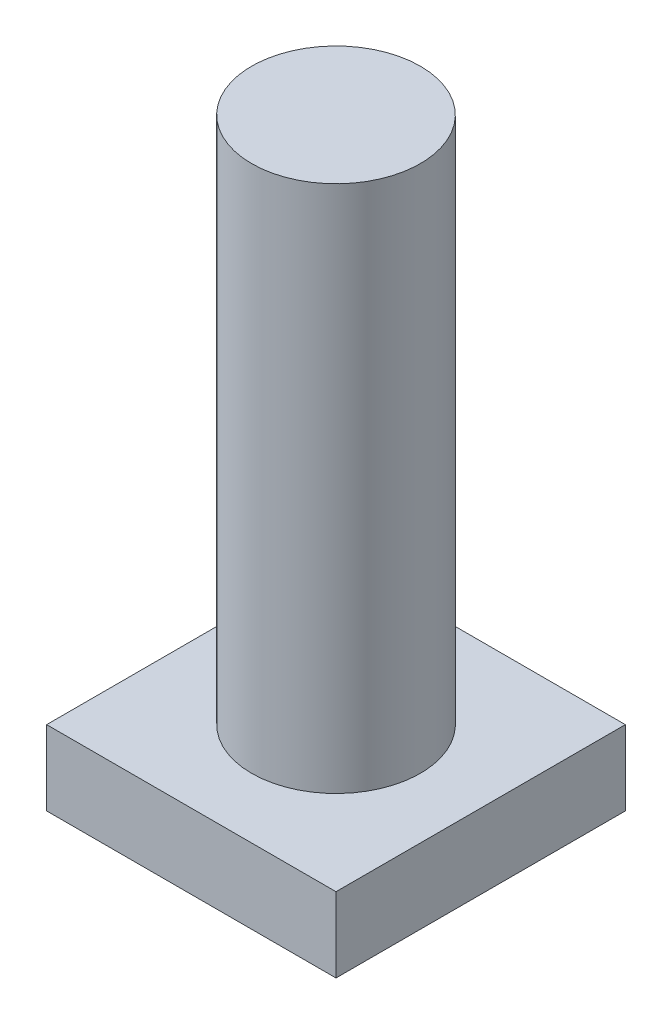
ISO-10303-21;
HEADER;
FILE_DESCRIPTION(('STEP AP214'),'2;1');
FILE_NAME('part.step','',(''),(''),'','','');
FILE_SCHEMA(('AUTOMOTIVE_DESIGN { 1 0 10303 214 1 1 1 1 }'));
ENDSEC;
DATA;
#1=APPLICATION_CONTEXT('core data for automotive mechanical design processes');
#2=APPLICATION_PROTOCOL_DEFINITION('international standard','automotive_design',2000,#1);
#3=PRODUCT_CONTEXT('',#1,'mechanical');
#4=PRODUCT('Part','Part','',(#3));
#5=PRODUCT_RELATED_PRODUCT_CATEGORY('part','',(#4));
#6=PRODUCT_DEFINITION_FORMATION('','',#4);
#7=PRODUCT_DEFINITION_CONTEXT('part definition',#1,'design');
#8=PRODUCT_DEFINITION('design','',#6,#7);
#9=PRODUCT_DEFINITION_SHAPE('','',#8);
#10=(LENGTH_UNIT() NAMED_UNIT(*) SI_UNIT(.MILLI.,.METRE.));
#11=(NAMED_UNIT(*) PLANE_ANGLE_UNIT() SI_UNIT($,.RADIAN.));
#12=(NAMED_UNIT(*) SI_UNIT($,.STERADIAN.) SOLID_ANGLE_UNIT());
#13=UNCERTAINTY_MEASURE_WITH_UNIT(LENGTH_MEASURE(1.E-05),#10,'distance_accuracy_value','');
#14=(GEOMETRIC_REPRESENTATION_CONTEXT(3) GLOBAL_UNCERTAINTY_ASSIGNED_CONTEXT((#13)) GLOBAL_UNIT_ASSIGNED_CONTEXT((#10,
#11,#12)) REPRESENTATION_CONTEXT('',''));
#15=CARTESIAN_POINT('',(0.,0.,0.));
#16=DIRECTION('',(0.,0.,1.));
#17=DIRECTION('',(1.,0.,0.));
#18=AXIS2_PLACEMENT_3D('',#15,#16,#17);
#19=CARTESIAN_POINT('',(-6.,3.1,-6.));
#20=DIRECTION('',(0.,1.,0.));
#21=DIRECTION('',(0.,0.,1.));
#22=AXIS2_PLACEMENT_3D('',#19,#20,#21);
#23=PLANE('',#22);
#24=DIRECTION('',(0.,0.,1.));
#25=VECTOR('',#24,1.);
#26=CARTESIAN_POINT('',(-6.,3.1,-6.));
#27=LINE('',#26,#25);
#28=CARTESIAN_POINT('',(-6.,3.1,-6.));
#29=VERTEX_POINT('',#28);
#30=CARTESIAN_POINT('',(-6.,3.1,6.));
#31=VERTEX_POINT('',#30);
#32=EDGE_CURVE('E103',#29,#31,#27,.T.);
#33=ORIENTED_EDGE('',*,*,#32,.T.);
#34=DIRECTION('',(1.,0.,0.));
#35=VECTOR('',#34,1.);
#36=CARTESIAN_POINT('',(-6.,3.1,6.));
#37=LINE('',#36,#35);
#38=CARTESIAN_POINT('',(6.00000000000003,3.1,6.));
#39=VERTEX_POINT('',#38);
#40=EDGE_CURVE('E88',#31,#39,#37,.T.);
#41=ORIENTED_EDGE('',*,*,#40,.T.);
#42=DIRECTION('',(0.,0.,-1.));
#43=VECTOR('',#42,1.);
#44=CARTESIAN_POINT('',(6.,3.1,-6.));
#45=LINE('',#44,#43);
#46=CARTESIAN_POINT('',(6.,3.1,-6.));
#47=VERTEX_POINT('',#46);
#48=EDGE_CURVE('E55',#39,#47,#45,.T.);
#49=ORIENTED_EDGE('',*,*,#48,.T.);
#50=DIRECTION('',(-1.,0.,0.));
#51=VECTOR('',#50,1.);
#52=CARTESIAN_POINT('',(-6.,3.1,-6.));
#53=LINE('',#52,#51);
#54=EDGE_CURVE('E50',#47,#29,#53,.T.);
#55=ORIENTED_EDGE('',*,*,#54,.T.);
#56=EDGE_LOOP('',(#33,#41,#49,#55));
#57=FACE_BOUND('',#56,.T.);
#58=CARTESIAN_POINT('',(0.,3.1,0.));
#59=DIRECTION('',(0.,1.,0.));
#60=DIRECTION('',(0.,0.,1.));
#61=AXIS2_PLACEMENT_3D('',#58,#59,#60);
#62=CIRCLE('',#61,3.5);
#63=CARTESIAN_POINT('',(0.,3.1,3.5));
#64=VERTEX_POINT('',#63);
#65=EDGE_CURVE('E96',#64,#64,#62,.T.);
#66=ORIENTED_EDGE('',*,*,#65,.F.);
#67=EDGE_LOOP('',(#66));
#68=FACE_BOUND('',#67,.T.);
#69=ADVANCED_FACE('F35',(#57,#68),#23,.T.);
#70=CARTESIAN_POINT('',(-6.,3.1,-6.));
#71=DIRECTION('',(1.,0.,0.));
#72=DIRECTION('',(0.,0.,-1.));
#73=AXIS2_PLACEMENT_3D('',#70,#71,#72);
#74=PLANE('',#73);
#75=DIRECTION('',(0.,0.,1.));
#76=VECTOR('',#75,1.);
#77=CARTESIAN_POINT('',(-6.,0.,-6.));
#78=LINE('',#77,#76);
#79=CARTESIAN_POINT('',(-6.,0.,-6.));
#80=VERTEX_POINT('',#79);
#81=CARTESIAN_POINT('',(-6.,0.,6.));
#82=VERTEX_POINT('',#81);
#83=EDGE_CURVE('E80',#80,#82,#78,.T.);
#84=ORIENTED_EDGE('',*,*,#83,.T.);
#85=DIRECTION('',(0.,-1.,0.));
#86=VECTOR('',#85,1.);
#87=CARTESIAN_POINT('',(-6.,3.1,6.));
#88=LINE('',#87,#86);
#89=EDGE_CURVE('E12',#31,#82,#88,.T.);
#90=ORIENTED_EDGE('',*,*,#89,.F.);
#91=ORIENTED_EDGE('',*,*,#32,.F.);
#92=DIRECTION('',(0.,-1.,0.));
#93=VECTOR('',#92,1.);
#94=CARTESIAN_POINT('',(-6.,3.1,-6.));
#95=LINE('',#94,#93);
#96=EDGE_CURVE('E92',#29,#80,#95,.T.);
#97=ORIENTED_EDGE('',*,*,#96,.T.);
#98=EDGE_LOOP('',(#84,#90,#91,#97));
#99=FACE_BOUND('',#98,.T.);
#100=ADVANCED_FACE('F37',(#99),#74,.F.);
#101=CARTESIAN_POINT('',(-6.,3.1,6.));
#102=DIRECTION('',(0.,0.,-1.));
#103=DIRECTION('',(-1.,0.,0.));
#104=AXIS2_PLACEMENT_3D('',#101,#102,#103);
#105=PLANE('',#104);
#106=DIRECTION('',(1.,0.,0.));
#107=VECTOR('',#106,1.);
#108=CARTESIAN_POINT('',(-6.,0.,6.));
#109=LINE('',#108,#107);
#110=CARTESIAN_POINT('',(6.00000000000003,0.,6.));
#111=VERTEX_POINT('',#110);
#112=EDGE_CURVE('E76',#82,#111,#109,.T.);
#113=ORIENTED_EDGE('',*,*,#112,.T.);
#114=DIRECTION('',(0.,-1.,0.));
#115=VECTOR('',#114,1.);
#116=CARTESIAN_POINT('',(6.00000000000003,3.1,6.));
#117=LINE('',#116,#115);
#118=EDGE_CURVE('E43',#39,#111,#117,.T.);
#119=ORIENTED_EDGE('',*,*,#118,.F.);
#120=ORIENTED_EDGE('',*,*,#40,.F.);
#121=ORIENTED_EDGE('',*,*,#89,.T.);
#122=EDGE_LOOP('',(#113,#119,#120,#121));
#123=FACE_BOUND('',#122,.T.);
#124=ADVANCED_FACE('F87',(#123),#105,.F.);
#125=CARTESIAN_POINT('',(6.,3.1,-6.));
#126=DIRECTION('',(-1.,0.,0.));
#127=DIRECTION('',(0.,0.,1.));
#128=AXIS2_PLACEMENT_3D('',#125,#126,#127);
#129=PLANE('',#128);
#130=DIRECTION('',(0.,0.,-1.));
#131=VECTOR('',#130,1.);
#132=CARTESIAN_POINT('',(6.,0.,-6.));
#133=LINE('',#132,#131);
#134=CARTESIAN_POINT('',(6.,0.,-6.));
#135=VERTEX_POINT('',#134);
#136=EDGE_CURVE('E81',#111,#135,#133,.T.);
#137=ORIENTED_EDGE('',*,*,#136,.T.);
#138=DIRECTION('',(0.,-1.,0.));
#139=VECTOR('',#138,1.);
#140=CARTESIAN_POINT('',(6.,3.1,-6.));
#141=LINE('',#140,#139);
#142=EDGE_CURVE('E109',#47,#135,#141,.T.);
#143=ORIENTED_EDGE('',*,*,#142,.F.);
#144=ORIENTED_EDGE('',*,*,#48,.F.);
#145=ORIENTED_EDGE('',*,*,#118,.T.);
#146=EDGE_LOOP('',(#137,#143,#144,#145));
#147=FACE_BOUND('',#146,.T.);
#148=ADVANCED_FACE('F112',(#147),#129,.F.);
#149=CARTESIAN_POINT('',(-6.,3.1,-6.));
#150=DIRECTION('',(0.,0.,1.));
#151=DIRECTION('',(1.,0.,0.));
#152=AXIS2_PLACEMENT_3D('',#149,#150,#151);
#153=PLANE('',#152);
#154=DIRECTION('',(-1.,0.,0.));
#155=VECTOR('',#154,1.);
#156=CARTESIAN_POINT('',(-6.,0.,-6.));
#157=LINE('',#156,#155);
#158=EDGE_CURVE('E101',#135,#80,#157,.T.);
#159=ORIENTED_EDGE('',*,*,#158,.T.);
#160=ORIENTED_EDGE('',*,*,#96,.F.);
#161=ORIENTED_EDGE('',*,*,#54,.F.);
#162=ORIENTED_EDGE('',*,*,#142,.T.);
#163=EDGE_LOOP('',(#159,#160,#161,#162));
#164=FACE_BOUND('',#163,.T.);
#165=ADVANCED_FACE('F114',(#164),#153,.F.);
#166=CARTESIAN_POINT('',(-6.,0.,-6.));
#167=DIRECTION('',(0.,1.,0.));
#168=DIRECTION('',(0.,0.,1.));
#169=AXIS2_PLACEMENT_3D('',#166,#167,#168);
#170=PLANE('',#169);
#171=ORIENTED_EDGE('',*,*,#83,.F.);
#172=ORIENTED_EDGE('',*,*,#158,.F.);
#173=ORIENTED_EDGE('',*,*,#136,.F.);
#174=ORIENTED_EDGE('',*,*,#112,.F.);
#175=EDGE_LOOP('',(#171,#172,#173,#174));
#176=FACE_BOUND('',#175,.T.);
#177=ADVANCED_FACE('F77',(#176),#170,.F.);
#178=CARTESIAN_POINT('',(0.,59.8994949366117,0.));
#179=DIRECTION('',(0.,-1.,0.));
#180=DIRECTION('',(0.,0.,-1.));
#181=AXIS2_PLACEMENT_3D('',#178,#179,#180);
#182=CYLINDRICAL_SURFACE('',#181,3.5);
#183=ORIENTED_EDGE('',*,*,#65,.T.);
#184=EDGE_LOOP('',(#183));
#185=FACE_BOUND('',#184,.T.);
#186=CARTESIAN_POINT('',(0.,25.,0.));
#187=DIRECTION('',(0.,1.,0.));
#188=DIRECTION('',(0.,0.,1.));
#189=AXIS2_PLACEMENT_3D('',#186,#187,#188);
#190=CIRCLE('',#189,3.5);
#191=CARTESIAN_POINT('',(0.,25.,3.5));
#192=VERTEX_POINT('',#191);
#193=EDGE_CURVE('E93',#192,#192,#190,.T.);
#194=ORIENTED_EDGE('',*,*,#193,.F.);
#195=EDGE_LOOP('',(#194));
#196=FACE_BOUND('',#195,.T.);
#197=ADVANCED_FACE('F121',(#185,#196),#182,.T.);
#198=CARTESIAN_POINT('',(-6.,25.,-6.));
#199=DIRECTION('',(0.,1.,0.));
#200=DIRECTION('',(0.,0.,1.));
#201=AXIS2_PLACEMENT_3D('',#198,#199,#200);
#202=PLANE('',#201);
#203=ORIENTED_EDGE('',*,*,#193,.T.);
#204=EDGE_LOOP('',(#203));
#205=FACE_BOUND('',#204,.T.);
#206=ADVANCED_FACE('F124',(#205),#202,.T.);
#207=CLOSED_SHELL('',(#69,#100,#124,#148,#165,#177,#197,#206));
#208=MANIFOLD_SOLID_BREP('B2',#207);
#209=ADVANCED_BREP_SHAPE_REPRESENTATION('',(#18,#208),#14);
#210=SHAPE_DEFINITION_REPRESENTATION(#9,#209);
ENDSEC;
END-ISO-10303-21;
